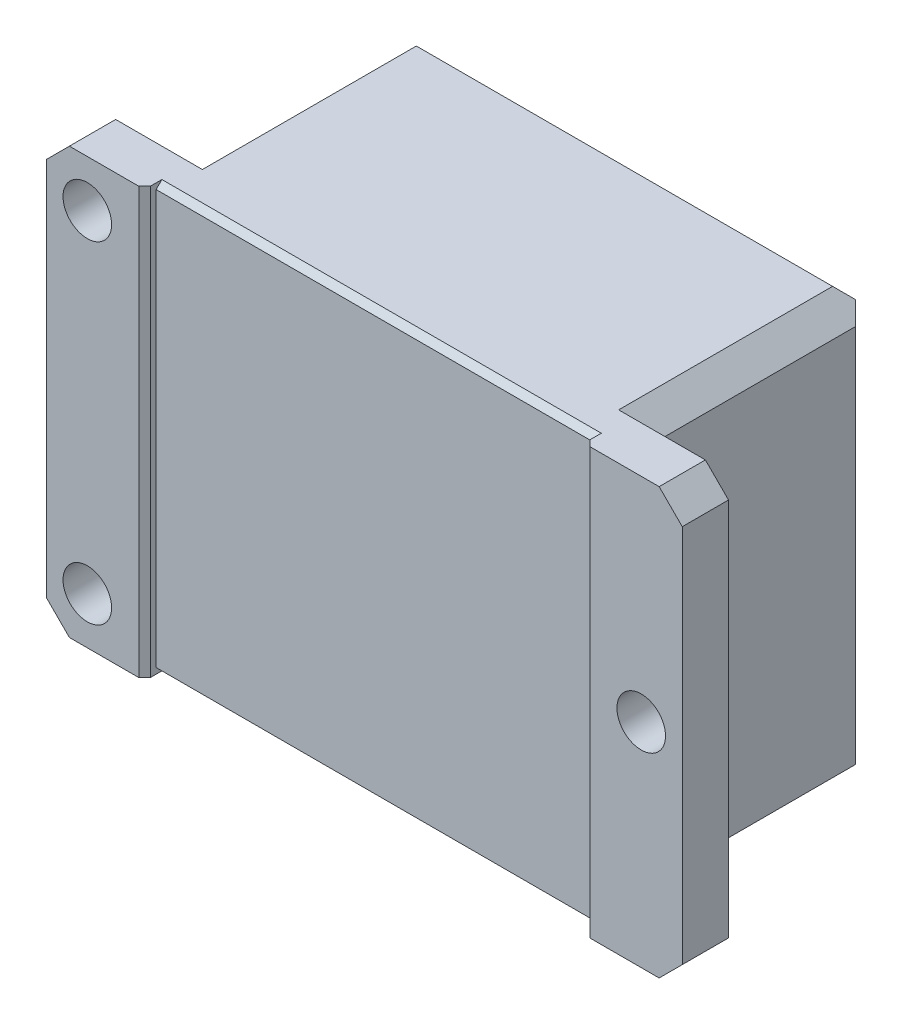
ISO-10303-21;
HEADER;
FILE_DESCRIPTION(('STEP AP214'),'2;1');
FILE_NAME('part.step','',(''),(''),'','','');
FILE_SCHEMA(('AUTOMOTIVE_DESIGN { 1 0 10303 214 1 1 1 1 }'));
ENDSEC;
DATA;
#1=APPLICATION_CONTEXT('core data for automotive mechanical design processes');
#2=APPLICATION_PROTOCOL_DEFINITION('international standard','automotive_design',2000,#1);
#3=PRODUCT_CONTEXT('',#1,'mechanical');
#4=PRODUCT('Part','Part','',(#3));
#5=PRODUCT_RELATED_PRODUCT_CATEGORY('part','',(#4));
#6=PRODUCT_DEFINITION_FORMATION('','',#4);
#7=PRODUCT_DEFINITION_CONTEXT('part definition',#1,'design');
#8=PRODUCT_DEFINITION('design','',#6,#7);
#9=PRODUCT_DEFINITION_SHAPE('','',#8);
#10=(LENGTH_UNIT() NAMED_UNIT(*) SI_UNIT(.MILLI.,.METRE.));
#11=(NAMED_UNIT(*) PLANE_ANGLE_UNIT() SI_UNIT($,.RADIAN.));
#12=(NAMED_UNIT(*) SI_UNIT($,.STERADIAN.) SOLID_ANGLE_UNIT());
#13=UNCERTAINTY_MEASURE_WITH_UNIT(LENGTH_MEASURE(1.E-05),#10,'distance_accuracy_value','');
#14=(GEOMETRIC_REPRESENTATION_CONTEXT(3) GLOBAL_UNCERTAINTY_ASSIGNED_CONTEXT((#13)) GLOBAL_UNIT_ASSIGNED_CONTEXT((#10,
#11,#12)) REPRESENTATION_CONTEXT('',''));
#15=CARTESIAN_POINT('',(0.,0.,0.));
#16=DIRECTION('',(0.,0.,1.));
#17=DIRECTION('',(1.,0.,0.));
#18=AXIS2_PLACEMENT_3D('',#15,#16,#17);
#19=CARTESIAN_POINT('',(0.,0.,24.));
#20=DIRECTION('',(-1.,0.,0.));
#21=DIRECTION('',(0.,0.,1.));
#22=AXIS2_PLACEMENT_3D('',#19,#20,#21);
#23=PLANE('',#22);
#24=DIRECTION('',(0.,-1.,0.));
#25=VECTOR('',#24,1.);
#26=CARTESIAN_POINT('',(0.,36.8,20.));
#27=LINE('',#26,#25);
#28=CARTESIAN_POINT('',(0.,34.8,20.));
#29=VERTEX_POINT('',#28);
#30=CARTESIAN_POINT('',(0.,2.00000000000001,20.));
#31=VERTEX_POINT('',#30);
#32=EDGE_CURVE('E439',#29,#31,#27,.T.);
#33=ORIENTED_EDGE('',*,*,#32,.F.);
#34=DIRECTION('',(0.,0.,1.));
#35=VECTOR('',#34,1.);
#36=CARTESIAN_POINT('',(0.,34.8,24.));
#37=LINE('',#36,#35);
#38=CARTESIAN_POINT('',(0.,34.8,24.));
#39=VERTEX_POINT('',#38);
#40=EDGE_CURVE('E392',#29,#39,#37,.T.);
#41=ORIENTED_EDGE('',*,*,#40,.T.);
#42=DIRECTION('',(0.,1.,0.));
#43=VECTOR('',#42,1.);
#44=CARTESIAN_POINT('',(0.,0.,24.));
#45=LINE('',#44,#43);
#46=CARTESIAN_POINT('',(0.,2.00000000000001,24.));
#47=VERTEX_POINT('',#46);
#48=EDGE_CURVE('E249',#47,#39,#45,.T.);
#49=ORIENTED_EDGE('',*,*,#48,.F.);
#50=DIRECTION('',(0.,0.,-1.));
#51=VECTOR('',#50,1.);
#52=CARTESIAN_POINT('',(0.,2.00000000000001,24.));
#53=LINE('',#52,#51);
#54=EDGE_CURVE('E389',#47,#31,#53,.T.);
#55=ORIENTED_EDGE('',*,*,#54,.T.);
#56=EDGE_LOOP('',(#33,#41,#49,#55));
#57=FACE_BOUND('',#56,.T.);
#58=ADVANCED_FACE('F34',(#57),#23,.F.);
#59=CARTESIAN_POINT('',(0.,0.,24.));
#60=DIRECTION('',(0.,0.,1.));
#61=DIRECTION('',(1.,0.,0.));
#62=AXIS2_PLACEMENT_3D('',#59,#60,#61);
#63=PLANE('',#62);
#64=CARTESIAN_POINT('',(-51.45,32.75,24.));
#65=DIRECTION('',(0.,0.,1.));
#66=DIRECTION('',(1.,0.,0.));
#67=AXIS2_PLACEMENT_3D('',#64,#65,#66);
#68=CIRCLE('',#67,2.1);
#69=CARTESIAN_POINT('',(-49.35,32.75,24.));
#70=VERTEX_POINT('',#69);
#71=EDGE_CURVE('E325',#70,#70,#68,.T.);
#72=ORIENTED_EDGE('',*,*,#71,.F.);
#73=EDGE_LOOP('',(#72));
#74=FACE_BOUND('',#73,.T.);
#75=CARTESIAN_POINT('',(-51.45,4.05000000000001,24.));
#76=DIRECTION('',(0.,0.,1.));
#77=DIRECTION('',(1.,0.,0.));
#78=AXIS2_PLACEMENT_3D('',#75,#76,#77);
#79=CIRCLE('',#78,2.1);
#80=CARTESIAN_POINT('',(-49.35,4.05000000000001,24.));
#81=VERTEX_POINT('',#80);
#82=EDGE_CURVE('E835',#81,#81,#79,.T.);
#83=ORIENTED_EDGE('',*,*,#82,.F.);
#84=EDGE_LOOP('',(#83));
#85=FACE_BOUND('',#84,.T.);
#86=DIRECTION('',(0.,-1.,0.));
#87=VECTOR('',#86,1.);
#88=CARTESIAN_POINT('',(-55.,0.,24.));
#89=LINE('',#88,#87);
#90=CARTESIAN_POINT('',(-55.,34.8,24.));
#91=VERTEX_POINT('',#90);
#92=CARTESIAN_POINT('',(-55.,2.00000000000001,24.));
#93=VERTEX_POINT('',#92);
#94=EDGE_CURVE('E263',#91,#93,#89,.T.);
#95=ORIENTED_EDGE('',*,*,#94,.T.);
#96=DIRECTION('',(-0.707106781186546,0.707106781186549,0.));
#97=VECTOR('',#96,1.);
#98=CARTESIAN_POINT('',(-26.5000000000001,-26.5,24.));
#99=LINE('',#98,#97);
#100=CARTESIAN_POINT('',(-53.,0.,24.));
#101=VERTEX_POINT('',#100);
#102=EDGE_CURVE('E42',#93,#101,#99,.F.);
#103=ORIENTED_EDGE('',*,*,#102,.T.);
#104=DIRECTION('',(1.,0.,0.));
#105=VECTOR('',#104,1.);
#106=CARTESIAN_POINT('',(0.,0.,24.));
#107=LINE('',#106,#105);
#108=CARTESIAN_POINT('',(-47.,0.,24.));
#109=VERTEX_POINT('',#108);
#110=EDGE_CURVE('E240',#101,#109,#107,.T.);
#111=ORIENTED_EDGE('',*,*,#110,.T.);
#112=DIRECTION('',(0.,1.,0.));
#113=VECTOR('',#112,1.);
#114=CARTESIAN_POINT('',(-47.,36.8,24.));
#115=LINE('',#114,#113);
#116=CARTESIAN_POINT('',(-47.,36.8,24.));
#117=VERTEX_POINT('',#116);
#118=EDGE_CURVE('E277',#109,#117,#115,.T.);
#119=ORIENTED_EDGE('',*,*,#118,.T.);
#120=DIRECTION('',(-1.,0.,0.));
#121=VECTOR('',#120,1.);
#122=CARTESIAN_POINT('',(0.,36.8,24.));
#123=LINE('',#122,#121);
#124=CARTESIAN_POINT('',(-53.,36.8,24.));
#125=VERTEX_POINT('',#124);
#126=EDGE_CURVE('E260',#117,#125,#123,.T.);
#127=ORIENTED_EDGE('',*,*,#126,.T.);
#128=DIRECTION('',(0.707106781186549,0.707106781186546,0.));
#129=VECTOR('',#128,1.);
#130=CARTESIAN_POINT('',(-44.8999999999999,44.9,24.));
#131=LINE('',#130,#129);
#132=EDGE_CURVE('E56',#125,#91,#131,.F.);
#133=ORIENTED_EDGE('',*,*,#132,.T.);
#134=EDGE_LOOP('',(#95,#103,#111,#119,#127,#133));
#135=FACE_BOUND('',#134,.T.);
#136=ADVANCED_FACE('F413',(#74,#85,#135),#63,.T.);
#137=CARTESIAN_POINT('',(0.,36.8,24.));
#138=DIRECTION('',(0.,-1.,0.));
#139=DIRECTION('',(0.,0.,-1.));
#140=AXIS2_PLACEMENT_3D('',#137,#138,#139);
#141=PLANE('',#140);
#142=CARTESIAN_POINT('',(-2.00000000000001,36.8,24.));
#143=VERTEX_POINT('',#142);
#144=CARTESIAN_POINT('',(-7.99999999999998,36.8,24.));
#145=VERTEX_POINT('',#144);
#146=EDGE_CURVE('E261',#143,#145,#123,.T.);
#147=ORIENTED_EDGE('',*,*,#146,.F.);
#148=DIRECTION('',(0.,0.,-1.));
#149=VECTOR('',#148,1.);
#150=CARTESIAN_POINT('',(-2.00000000000001,36.8,24.));
#151=LINE('',#150,#149);
#152=CARTESIAN_POINT('',(-2.00000000000001,36.8,20.));
#153=VERTEX_POINT('',#152);
#154=EDGE_CURVE('E382',#143,#153,#151,.T.);
#155=ORIENTED_EDGE('',*,*,#154,.T.);
#156=DIRECTION('',(1.,0.,0.));
#157=VECTOR('',#156,1.);
#158=CARTESIAN_POINT('',(0.,36.8,20.));
#159=LINE('',#158,#157);
#160=CARTESIAN_POINT('',(-9.50000000000001,36.8,20.));
#161=VERTEX_POINT('',#160);
#162=EDGE_CURVE('E433',#161,#153,#159,.T.);
#163=ORIENTED_EDGE('',*,*,#162,.F.);
#164=DIRECTION('',(0.,0.,-1.));
#165=VECTOR('',#164,1.);
#166=CARTESIAN_POINT('',(-9.50000000000001,36.8,24.));
#167=LINE('',#166,#165);
#168=CARTESIAN_POINT('',(-9.50000000000001,36.8,1.5));
#169=VERTEX_POINT('',#168);
#170=EDGE_CURVE('E355',#161,#169,#167,.T.);
#171=ORIENTED_EDGE('',*,*,#170,.T.);
#172=DIRECTION('',(-1.,0.,0.));
#173=VECTOR('',#172,1.);
#174=CARTESIAN_POINT('',(0.,36.8,1.5));
#175=LINE('',#174,#173);
#176=CARTESIAN_POINT('',(-45.5,36.8,1.5));
#177=VERTEX_POINT('',#176);
#178=EDGE_CURVE('E311',#169,#177,#175,.T.);
#179=ORIENTED_EDGE('',*,*,#178,.T.);
#180=DIRECTION('',(0.,0.,1.));
#181=VECTOR('',#180,1.);
#182=CARTESIAN_POINT('',(-45.5,36.8,24.));
#183=LINE('',#182,#181);
#184=CARTESIAN_POINT('',(-45.5,36.8,20.));
#185=VERTEX_POINT('',#184);
#186=EDGE_CURVE('E358',#177,#185,#183,.T.);
#187=ORIENTED_EDGE('',*,*,#186,.T.);
#188=DIRECTION('',(1.,0.,0.));
#189=VECTOR('',#188,1.);
#190=CARTESIAN_POINT('',(-55.,36.8,20.));
#191=LINE('',#190,#189);
#192=CARTESIAN_POINT('',(-53.,36.8,20.));
#193=VERTEX_POINT('',#192);
#194=EDGE_CURVE('E428',#193,#185,#191,.T.);
#195=ORIENTED_EDGE('',*,*,#194,.F.);
#196=DIRECTION('',(0.,0.,1.));
#197=VECTOR('',#196,1.);
#198=CARTESIAN_POINT('',(-53.,36.8,24.));
#199=LINE('',#198,#197);
#200=EDGE_CURVE('E380',#193,#125,#199,.T.);
#201=ORIENTED_EDGE('',*,*,#200,.T.);
#202=ORIENTED_EDGE('',*,*,#126,.F.);
#203=DIRECTION('',(0.707106781186552,0.,-0.707106781186543));
#204=VECTOR('',#203,1.);
#205=CARTESIAN_POINT('',(-46.5,36.8,23.5));
#206=LINE('',#205,#204);
#207=CARTESIAN_POINT('',(-46.5,36.8,23.5));
#208=VERTEX_POINT('',#207);
#209=EDGE_CURVE('E231',#117,#208,#206,.T.);
#210=ORIENTED_EDGE('',*,*,#209,.T.);
#211=DIRECTION('',(0.,0.,1.));
#212=VECTOR('',#211,1.);
#213=CARTESIAN_POINT('',(-46.5,36.8,23.));
#214=LINE('',#213,#212);
#215=CARTESIAN_POINT('',(-46.5,36.8,22.5));
#216=VERTEX_POINT('',#215);
#217=EDGE_CURVE('E246',#216,#208,#214,.T.);
#218=ORIENTED_EDGE('',*,*,#217,.F.);
#219=DIRECTION('',(1.,0.,0.));
#220=VECTOR('',#219,1.);
#221=CARTESIAN_POINT('',(-8.49999999999999,36.8,22.5));
#222=LINE('',#221,#220);
#223=CARTESIAN_POINT('',(-8.49999999999999,36.8,22.5));
#224=VERTEX_POINT('',#223);
#225=EDGE_CURVE('E244',#216,#224,#222,.T.);
#226=ORIENTED_EDGE('',*,*,#225,.T.);
#227=DIRECTION('',(0.,0.,1.));
#228=VECTOR('',#227,1.);
#229=CARTESIAN_POINT('',(-8.49999999999999,36.8,23.));
#230=LINE('',#229,#228);
#231=CARTESIAN_POINT('',(-8.49999999999999,36.8,23.5));
#232=VERTEX_POINT('',#231);
#233=EDGE_CURVE('E236',#224,#232,#230,.T.);
#234=ORIENTED_EDGE('',*,*,#233,.T.);
#235=DIRECTION('',(0.707106781186552,0.,0.707106781186543));
#236=VECTOR('',#235,1.);
#237=CARTESIAN_POINT('',(-8.49999999999999,36.8,23.5));
#238=LINE('',#237,#236);
#239=EDGE_CURVE('E222',#232,#145,#238,.T.);
#240=ORIENTED_EDGE('',*,*,#239,.T.);
#241=EDGE_LOOP('',(#147,#155,#163,#171,#179,#187,#195,#201,#202,#210,#218,#226,#234,#240));
#242=FACE_BOUND('',#241,.T.);
#243=ADVANCED_FACE('F242',(#242),#141,.F.);
#244=CARTESIAN_POINT('',(-55.,0.,24.));
#245=DIRECTION('',(1.,0.,0.));
#246=DIRECTION('',(0.,0.,-1.));
#247=AXIS2_PLACEMENT_3D('',#244,#245,#246);
#248=PLANE('',#247);
#249=DIRECTION('',(0.,1.,0.));
#250=VECTOR('',#249,1.);
#251=CARTESIAN_POINT('',(-55.,36.8,20.));
#252=LINE('',#251,#250);
#253=CARTESIAN_POINT('',(-55.,2.00000000000002,20.));
#254=VERTEX_POINT('',#253);
#255=CARTESIAN_POINT('',(-55.,34.8,20.));
#256=VERTEX_POINT('',#255);
#257=EDGE_CURVE('E332',#254,#256,#252,.T.);
#258=ORIENTED_EDGE('',*,*,#257,.F.);
#259=DIRECTION('',(0.,0.,1.));
#260=VECTOR('',#259,1.);
#261=CARTESIAN_POINT('',(-55.,2.00000000000001,24.));
#262=LINE('',#261,#260);
#263=EDGE_CURVE('E49',#254,#93,#262,.T.);
#264=ORIENTED_EDGE('',*,*,#263,.T.);
#265=ORIENTED_EDGE('',*,*,#94,.F.);
#266=DIRECTION('',(0.,0.,-1.));
#267=VECTOR('',#266,1.);
#268=CARTESIAN_POINT('',(-55.,34.8,24.));
#269=LINE('',#268,#267);
#270=EDGE_CURVE('E407',#91,#256,#269,.T.);
#271=ORIENTED_EDGE('',*,*,#270,.T.);
#272=EDGE_LOOP('',(#258,#264,#265,#271));
#273=FACE_BOUND('',#272,.T.);
#274=ADVANCED_FACE('F426',(#273),#248,.F.);
#275=CARTESIAN_POINT('',(0.,0.,24.));
#276=DIRECTION('',(0.,1.,0.));
#277=DIRECTION('',(-1.,0.,0.));
#278=AXIS2_PLACEMENT_3D('',#275,#276,#277);
#279=PLANE('',#278);
#280=DIRECTION('',(-1.,0.,0.));
#281=VECTOR('',#280,1.);
#282=CARTESIAN_POINT('',(0.,0.,20.));
#283=LINE('',#282,#281);
#284=CARTESIAN_POINT('',(-2.00000000000002,0.,20.));
#285=VERTEX_POINT('',#284);
#286=CARTESIAN_POINT('',(-9.50000000000002,0.,20.));
#287=VERTEX_POINT('',#286);
#288=EDGE_CURVE('E475',#285,#287,#283,.T.);
#289=ORIENTED_EDGE('',*,*,#288,.F.);
#290=DIRECTION('',(0.,0.,1.));
#291=VECTOR('',#290,1.);
#292=CARTESIAN_POINT('',(-2.00000000000002,0.,24.));
#293=LINE('',#292,#291);
#294=CARTESIAN_POINT('',(-2.00000000000002,0.,24.));
#295=VERTEX_POINT('',#294);
#296=EDGE_CURVE('E401',#285,#295,#293,.T.);
#297=ORIENTED_EDGE('',*,*,#296,.T.);
#298=CARTESIAN_POINT('',(-7.99999999999998,0.,24.));
#299=VERTEX_POINT('',#298);
#300=EDGE_CURVE('E265',#299,#295,#107,.T.);
#301=ORIENTED_EDGE('',*,*,#300,.F.);
#302=DIRECTION('',(-0.707106781186552,0.,-0.707106781186543));
#303=VECTOR('',#302,1.);
#304=CARTESIAN_POINT('',(-8.49999999999999,0.,23.5));
#305=LINE('',#304,#303);
#306=CARTESIAN_POINT('',(-8.49999999999999,0.,23.5));
#307=VERTEX_POINT('',#306);
#308=EDGE_CURVE('E272',#299,#307,#305,.T.);
#309=ORIENTED_EDGE('',*,*,#308,.T.);
#310=DIRECTION('',(0.,0.,1.));
#311=VECTOR('',#310,1.);
#312=CARTESIAN_POINT('',(-8.49999999999999,0.,23.));
#313=LINE('',#312,#311);
#314=CARTESIAN_POINT('',(-8.49999999999999,0.,22.5));
#315=VERTEX_POINT('',#314);
#316=EDGE_CURVE('E239',#315,#307,#313,.T.);
#317=ORIENTED_EDGE('',*,*,#316,.F.);
#318=DIRECTION('',(-1.,0.,0.));
#319=VECTOR('',#318,1.);
#320=CARTESIAN_POINT('',(-46.5,0.,22.5));
#321=LINE('',#320,#319);
#322=CARTESIAN_POINT('',(-46.5,0.,22.5));
#323=VERTEX_POINT('',#322);
#324=EDGE_CURVE('E285',#315,#323,#321,.T.);
#325=ORIENTED_EDGE('',*,*,#324,.T.);
#326=DIRECTION('',(0.,0.,1.));
#327=VECTOR('',#326,1.);
#328=CARTESIAN_POINT('',(-46.5,0.,23.));
#329=LINE('',#328,#327);
#330=CARTESIAN_POINT('',(-46.5,0.,23.5));
#331=VERTEX_POINT('',#330);
#332=EDGE_CURVE('E251',#323,#331,#329,.T.);
#333=ORIENTED_EDGE('',*,*,#332,.T.);
#334=DIRECTION('',(-0.707106781186552,0.,0.707106781186543));
#335=VECTOR('',#334,1.);
#336=CARTESIAN_POINT('',(-46.5,0.,23.5));
#337=LINE('',#336,#335);
#338=EDGE_CURVE('E269',#331,#109,#337,.T.);
#339=ORIENTED_EDGE('',*,*,#338,.T.);
#340=ORIENTED_EDGE('',*,*,#110,.F.);
#341=DIRECTION('',(0.,0.,-1.));
#342=VECTOR('',#341,1.);
#343=CARTESIAN_POINT('',(-53.,0.,24.));
#344=LINE('',#343,#342);
#345=CARTESIAN_POINT('',(-53.,0.,20.));
#346=VERTEX_POINT('',#345);
#347=EDGE_CURVE('E398',#101,#346,#344,.T.);
#348=ORIENTED_EDGE('',*,*,#347,.T.);
#349=DIRECTION('',(-1.,0.,0.));
#350=VECTOR('',#349,1.);
#351=CARTESIAN_POINT('',(-55.,0.,20.));
#352=LINE('',#351,#350);
#353=CARTESIAN_POINT('',(-45.5,0.,20.));
#354=VERTEX_POINT('',#353);
#355=EDGE_CURVE('E425',#354,#346,#352,.T.);
#356=ORIENTED_EDGE('',*,*,#355,.F.);
#357=DIRECTION('',(0.,0.,-1.));
#358=VECTOR('',#357,1.);
#359=CARTESIAN_POINT('',(-45.5,0.,24.));
#360=LINE('',#359,#358);
#361=CARTESIAN_POINT('',(-45.5,0.,1.5));
#362=VERTEX_POINT('',#361);
#363=EDGE_CURVE('E335',#354,#362,#360,.T.);
#364=ORIENTED_EDGE('',*,*,#363,.T.);
#365=DIRECTION('',(1.,0.,0.));
#366=VECTOR('',#365,1.);
#367=CARTESIAN_POINT('',(0.,0.,1.5));
#368=LINE('',#367,#366);
#369=CARTESIAN_POINT('',(-9.50000000000002,0.,1.5));
#370=VERTEX_POINT('',#369);
#371=EDGE_CURVE('E317',#362,#370,#368,.T.);
#372=ORIENTED_EDGE('',*,*,#371,.T.);
#373=DIRECTION('',(0.,0.,1.));
#374=VECTOR('',#373,1.);
#375=CARTESIAN_POINT('',(-9.50000000000002,0.,24.));
#376=LINE('',#375,#374);
#377=EDGE_CURVE('E320',#370,#287,#376,.T.);
#378=ORIENTED_EDGE('',*,*,#377,.T.);
#379=EDGE_LOOP('',(#289,#297,#301,#309,#317,#325,#333,#339,#340,#348,#356,#364,#372,#378));
#380=FACE_BOUND('',#379,.T.);
#381=ADVANCED_FACE('F418',(#380),#279,.F.);
#382=CARTESIAN_POINT('',(-3.55,18.4,24.));
#383=DIRECTION('',(0.,0.,1.));
#384=DIRECTION('',(1.,0.,0.));
#385=AXIS2_PLACEMENT_3D('',#382,#383,#384);
#386=CIRCLE('',#385,2.1);
#387=CARTESIAN_POINT('',(-1.45,18.4,24.));
#388=VERTEX_POINT('',#387);
#389=EDGE_CURVE('E831',#388,#388,#386,.T.);
#390=ORIENTED_EDGE('',*,*,#389,.F.);
#391=EDGE_LOOP('',(#390));
#392=FACE_BOUND('',#391,.T.);
#393=ORIENTED_EDGE('',*,*,#48,.T.);
#394=DIRECTION('',(0.707106781186546,-0.707106781186549,0.));
#395=VECTOR('',#394,1.);
#396=CARTESIAN_POINT('',(17.4,17.3999999999999,24.));
#397=LINE('',#396,#395);
#398=EDGE_CURVE('E396',#39,#143,#397,.F.);
#399=ORIENTED_EDGE('',*,*,#398,.T.);
#400=ORIENTED_EDGE('',*,*,#146,.T.);
#401=DIRECTION('',(0.,-1.,0.));
#402=VECTOR('',#401,1.);
#403=CARTESIAN_POINT('',(-7.99999999999998,0.,24.));
#404=LINE('',#403,#402);
#405=EDGE_CURVE('E227',#145,#299,#404,.T.);
#406=ORIENTED_EDGE('',*,*,#405,.T.);
#407=ORIENTED_EDGE('',*,*,#300,.T.);
#408=DIRECTION('',(-0.707106781186549,-0.707106781186546,0.));
#409=VECTOR('',#408,1.);
#410=CARTESIAN_POINT('',(-1.,1.00000000000001,24.));
#411=LINE('',#410,#409);
#412=EDGE_CURVE('E394',#295,#47,#411,.F.);
#413=ORIENTED_EDGE('',*,*,#412,.T.);
#414=EDGE_LOOP('',(#393,#399,#400,#406,#407,#413));
#415=FACE_BOUND('',#414,.T.);
#416=ADVANCED_FACE('F463',(#392,#415),#63,.T.);
#417=CARTESIAN_POINT('',(0.,0.,0.));
#418=DIRECTION('',(0.,0.,1.));
#419=DIRECTION('',(1.,0.,0.));
#420=AXIS2_PLACEMENT_3D('',#417,#418,#419);
#421=PLANE('',#420);
#422=DIRECTION('',(1.,0.,0.));
#423=VECTOR('',#422,1.);
#424=CARTESIAN_POINT('',(0.,35.3,0.));
#425=LINE('',#424,#423);
#426=CARTESIAN_POINT('',(-46.,35.3,0.));
#427=VERTEX_POINT('',#426);
#428=CARTESIAN_POINT('',(-9.,35.3,0.));
#429=VERTEX_POINT('',#428);
#430=EDGE_CURVE('E306',#427,#429,#425,.T.);
#431=ORIENTED_EDGE('',*,*,#430,.T.);
#432=DIRECTION('',(0.,-1.,0.));
#433=VECTOR('',#432,1.);
#434=CARTESIAN_POINT('',(-9.00000000000001,0.,0.));
#435=LINE('',#434,#433);
#436=CARTESIAN_POINT('',(-9.00000000000001,1.5,0.));
#437=VERTEX_POINT('',#436);
#438=EDGE_CURVE('E308',#429,#437,#435,.T.);
#439=ORIENTED_EDGE('',*,*,#438,.T.);
#440=DIRECTION('',(-1.,0.,0.));
#441=VECTOR('',#440,1.);
#442=CARTESIAN_POINT('',(0.,1.5,0.));
#443=LINE('',#442,#441);
#444=CARTESIAN_POINT('',(-46.,1.5,0.));
#445=VERTEX_POINT('',#444);
#446=EDGE_CURVE('E301',#437,#445,#443,.T.);
#447=ORIENTED_EDGE('',*,*,#446,.T.);
#448=DIRECTION('',(0.,1.,0.));
#449=VECTOR('',#448,1.);
#450=CARTESIAN_POINT('',(-46.,0.,0.));
#451=LINE('',#450,#449);
#452=EDGE_CURVE('E304',#445,#427,#451,.T.);
#453=ORIENTED_EDGE('',*,*,#452,.T.);
#454=EDGE_LOOP('',(#431,#439,#447,#453));
#455=FACE_BOUND('',#454,.T.);
#456=ADVANCED_FACE('F559',(#455),#421,.F.);
#457=CARTESIAN_POINT('',(-46.5,0.,23.));
#458=DIRECTION('',(-1.,0.,0.));
#459=DIRECTION('',(0.,0.,1.));
#460=AXIS2_PLACEMENT_3D('',#457,#458,#459);
#461=PLANE('',#460);
#462=ORIENTED_EDGE('',*,*,#217,.T.);
#463=DIRECTION('',(0.,-1.,0.));
#464=VECTOR('',#463,1.);
#465=CARTESIAN_POINT('',(-46.5,0.,23.5));
#466=LINE('',#465,#464);
#467=EDGE_CURVE('E274',#208,#331,#466,.T.);
#468=ORIENTED_EDGE('',*,*,#467,.T.);
#469=ORIENTED_EDGE('',*,*,#332,.F.);
#470=DIRECTION('',(0.,0.707106781186543,0.707106781186552));
#471=VECTOR('',#470,1.);
#472=CARTESIAN_POINT('',(-46.5,0.249999999999989,22.75));
#473=LINE('',#472,#471);
#474=CARTESIAN_POINT('',(-46.5,0.499999999999981,23.));
#475=VERTEX_POINT('',#474);
#476=EDGE_CURVE('E291',#323,#475,#473,.T.);
#477=ORIENTED_EDGE('',*,*,#476,.T.);
#478=DIRECTION('',(0.,-1.,0.));
#479=VECTOR('',#478,1.);
#480=CARTESIAN_POINT('',(-46.5,0.,23.));
#481=LINE('',#480,#479);
#482=CARTESIAN_POINT('',(-46.5,36.3,23.));
#483=VERTEX_POINT('',#482);
#484=EDGE_CURVE('E440',#483,#475,#481,.T.);
#485=ORIENTED_EDGE('',*,*,#484,.F.);
#486=DIRECTION('',(0.,0.707106781186552,-0.707106781186543));
#487=VECTOR('',#486,1.);
#488=CARTESIAN_POINT('',(-46.5,18.1499999999997,41.15));
#489=LINE('',#488,#487);
#490=EDGE_CURVE('E293',#483,#216,#489,.T.);
#491=ORIENTED_EDGE('',*,*,#490,.T.);
#492=EDGE_LOOP('',(#462,#468,#469,#477,#485,#491));
#493=FACE_BOUND('',#492,.T.);
#494=ADVANCED_FACE('F452',(#493),#461,.F.);
#495=CARTESIAN_POINT('',(-8.49999999999999,0.,23.));
#496=DIRECTION('',(1.,0.,0.));
#497=DIRECTION('',(0.,0.,-1.));
#498=AXIS2_PLACEMENT_3D('',#495,#496,#497);
#499=PLANE('',#498);
#500=ORIENTED_EDGE('',*,*,#316,.T.);
#501=DIRECTION('',(0.,1.,0.));
#502=VECTOR('',#501,1.);
#503=CARTESIAN_POINT('',(-8.49999999999999,36.8,23.5));
#504=LINE('',#503,#502);
#505=EDGE_CURVE('E226',#307,#232,#504,.T.);
#506=ORIENTED_EDGE('',*,*,#505,.T.);
#507=ORIENTED_EDGE('',*,*,#233,.F.);
#508=DIRECTION('',(0.,-0.707106781186552,0.707106781186543));
#509=VECTOR('',#508,1.);
#510=CARTESIAN_POINT('',(-8.49999999999999,18.1499999999997,41.15));
#511=LINE('',#510,#509);
#512=CARTESIAN_POINT('',(-8.49999999999999,36.3,23.));
#513=VERTEX_POINT('',#512);
#514=EDGE_CURVE('E296',#224,#513,#511,.T.);
#515=ORIENTED_EDGE('',*,*,#514,.T.);
#516=DIRECTION('',(0.,1.,0.));
#517=VECTOR('',#516,1.);
#518=CARTESIAN_POINT('',(-8.49999999999999,0.,23.));
#519=LINE('',#518,#517);
#520=CARTESIAN_POINT('',(-8.49999999999999,0.499999999999986,23.));
#521=VERTEX_POINT('',#520);
#522=EDGE_CURVE('E257',#521,#513,#519,.T.);
#523=ORIENTED_EDGE('',*,*,#522,.F.);
#524=DIRECTION('',(0.,-0.707106781186543,-0.707106781186552));
#525=VECTOR('',#524,1.);
#526=CARTESIAN_POINT('',(-8.49999999999999,0.249999999999993,22.75));
#527=LINE('',#526,#525);
#528=EDGE_CURVE('E289',#521,#315,#527,.T.);
#529=ORIENTED_EDGE('',*,*,#528,.T.);
#530=EDGE_LOOP('',(#500,#506,#507,#515,#523,#529));
#531=FACE_BOUND('',#530,.T.);
#532=ADVANCED_FACE('F235',(#531),#499,.F.);
#533=CARTESIAN_POINT('',(0.,0.,23.));
#534=DIRECTION('',(0.,0.,1.));
#535=DIRECTION('',(1.,0.,0.));
#536=AXIS2_PLACEMENT_3D('',#533,#534,#535);
#537=PLANE('',#536);
#538=ORIENTED_EDGE('',*,*,#484,.T.);
#539=DIRECTION('',(1.,0.,0.));
#540=VECTOR('',#539,1.);
#541=CARTESIAN_POINT('',(-8.49999999999999,0.499999999999986,23.));
#542=LINE('',#541,#540);
#543=EDGE_CURVE('E282',#475,#521,#542,.T.);
#544=ORIENTED_EDGE('',*,*,#543,.T.);
#545=ORIENTED_EDGE('',*,*,#522,.T.);
#546=DIRECTION('',(-1.,0.,0.));
#547=VECTOR('',#546,1.);
#548=CARTESIAN_POINT('',(-46.5,36.3,23.));
#549=LINE('',#548,#547);
#550=EDGE_CURVE('E279',#513,#483,#549,.T.);
#551=ORIENTED_EDGE('',*,*,#550,.T.);
#552=EDGE_LOOP('',(#538,#544,#545,#551));
#553=FACE_BOUND('',#552,.T.);
#554=ADVANCED_FACE('F446',(#553),#537,.T.);
#555=CARTESIAN_POINT('',(-8.49999999999999,0.,23.5));
#556=DIRECTION('',(-0.707106781186543,0.,0.707106781186552));
#557=DIRECTION('',(0.,-1.,0.));
#558=AXIS2_PLACEMENT_3D('',#555,#556,#557);
#559=PLANE('',#558);
#560=ORIENTED_EDGE('',*,*,#308,.F.);
#561=ORIENTED_EDGE('',*,*,#405,.F.);
#562=ORIENTED_EDGE('',*,*,#239,.F.);
#563=ORIENTED_EDGE('',*,*,#505,.F.);
#564=EDGE_LOOP('',(#560,#561,#562,#563));
#565=FACE_BOUND('',#564,.T.);
#566=ADVANCED_FACE('F225',(#565),#559,.T.);
#567=CARTESIAN_POINT('',(-46.5,0.,23.5));
#568=DIRECTION('',(0.707106781186543,0.,0.707106781186552));
#569=DIRECTION('',(0.,1.,0.));
#570=AXIS2_PLACEMENT_3D('',#567,#568,#569);
#571=PLANE('',#570);
#572=ORIENTED_EDGE('',*,*,#209,.F.);
#573=ORIENTED_EDGE('',*,*,#118,.F.);
#574=ORIENTED_EDGE('',*,*,#338,.F.);
#575=ORIENTED_EDGE('',*,*,#467,.F.);
#576=EDGE_LOOP('',(#572,#573,#574,#575));
#577=FACE_BOUND('',#576,.T.);
#578=ADVANCED_FACE('F513',(#577),#571,.T.);
#579=CARTESIAN_POINT('',(0.,0.499999999999987,23.));
#580=DIRECTION('',(0.,-0.707106781186552,0.707106781186543));
#581=DIRECTION('',(-1.,0.,0.));
#582=AXIS2_PLACEMENT_3D('',#579,#580,#581);
#583=PLANE('',#582);
#584=ORIENTED_EDGE('',*,*,#476,.F.);
#585=ORIENTED_EDGE('',*,*,#324,.F.);
#586=ORIENTED_EDGE('',*,*,#528,.F.);
#587=ORIENTED_EDGE('',*,*,#543,.F.);
#588=EDGE_LOOP('',(#584,#585,#586,#587));
#589=FACE_BOUND('',#588,.T.);
#590=ADVANCED_FACE('F456',(#589),#583,.T.);
#591=CARTESIAN_POINT('',(0.,36.3,23.));
#592=DIRECTION('',(0.,0.707106781186543,0.707106781186552));
#593=DIRECTION('',(1.,0.,0.));
#594=AXIS2_PLACEMENT_3D('',#591,#592,#593);
#595=PLANE('',#594);
#596=ORIENTED_EDGE('',*,*,#514,.F.);
#597=ORIENTED_EDGE('',*,*,#225,.F.);
#598=ORIENTED_EDGE('',*,*,#490,.F.);
#599=ORIENTED_EDGE('',*,*,#550,.F.);
#600=EDGE_LOOP('',(#596,#597,#598,#599));
#601=FACE_BOUND('',#600,.T.);
#602=ADVANCED_FACE('F450',(#601),#595,.T.);
#603=CARTESIAN_POINT('',(-47.5,36.8,20.));
#604=DIRECTION('',(1.,0.,0.));
#605=DIRECTION('',(0.,1.,0.));
#606=AXIS2_PLACEMENT_3D('',#603,#604,#605);
#607=PLANE('',#606);
#608=CARTESIAN_POINT('',(-47.5,18.4,10.));
#609=DIRECTION('',(1.,0.,0.));
#610=DIRECTION('',(0.,1.,0.));
#611=AXIS2_PLACEMENT_3D('',#608,#609,#610);
#612=CIRCLE('',#611,5.);
#613=CARTESIAN_POINT('',(-47.5,23.4,10.));
#614=VERTEX_POINT('',#613);
#615=EDGE_CURVE('E11',#614,#614,#612,.F.);
#616=ORIENTED_EDGE('',*,*,#615,.F.);
#617=EDGE_LOOP('',(#616));
#618=FACE_BOUND('',#617,.T.);
#619=DIRECTION('',(0.,-1.,0.));
#620=VECTOR('',#619,1.);
#621=CARTESIAN_POINT('',(-47.5,36.8,1.5));
#622=LINE('',#621,#620);
#623=CARTESIAN_POINT('',(-47.5,34.8,1.5));
#624=VERTEX_POINT('',#623);
#625=CARTESIAN_POINT('',(-47.5,1.99999999999999,1.5));
#626=VERTEX_POINT('',#625);
#627=EDGE_CURVE('E314',#624,#626,#622,.T.);
#628=ORIENTED_EDGE('',*,*,#627,.T.);
#629=DIRECTION('',(0.,0.,1.));
#630=VECTOR('',#629,1.);
#631=CARTESIAN_POINT('',(-47.5,1.99999999999999,20.));
#632=LINE('',#631,#630);
#633=CARTESIAN_POINT('',(-47.5,2.,20.));
#634=VERTEX_POINT('',#633);
#635=EDGE_CURVE('E349',#626,#634,#632,.T.);
#636=ORIENTED_EDGE('',*,*,#635,.T.);
#637=DIRECTION('',(0.,-1.,0.));
#638=VECTOR('',#637,1.);
#639=CARTESIAN_POINT('',(-47.5,36.8,20.));
#640=LINE('',#639,#638);
#641=CARTESIAN_POINT('',(-47.5,34.8,20.));
#642=VERTEX_POINT('',#641);
#643=EDGE_CURVE('E430',#642,#634,#640,.T.);
#644=ORIENTED_EDGE('',*,*,#643,.F.);
#645=DIRECTION('',(0.,0.,-1.));
#646=VECTOR('',#645,1.);
#647=CARTESIAN_POINT('',(-47.5,34.8,20.));
#648=LINE('',#647,#646);
#649=EDGE_CURVE('E346',#642,#624,#648,.T.);
#650=ORIENTED_EDGE('',*,*,#649,.T.);
#651=EDGE_LOOP('',(#628,#636,#644,#650));
#652=FACE_BOUND('',#651,.T.);
#653=ADVANCED_FACE('F521',(#618,#652),#607,.F.);
#654=CARTESIAN_POINT('',(0.,0.,20.));
#655=DIRECTION('',(0.,0.,1.));
#656=DIRECTION('',(1.,0.,0.));
#657=AXIS2_PLACEMENT_3D('',#654,#655,#656);
#658=PLANE('',#657);
#659=CARTESIAN_POINT('',(-51.45,32.75,20.));
#660=DIRECTION('',(0.,0.,-1.));
#661=DIRECTION('',(-1.,0.,0.));
#662=AXIS2_PLACEMENT_3D('',#659,#660,#661);
#663=CIRCLE('',#662,2.1);
#664=CARTESIAN_POINT('',(-53.55,32.75,20.));
#665=VERTEX_POINT('',#664);
#666=EDGE_CURVE('E825',#665,#665,#663,.T.);
#667=ORIENTED_EDGE('',*,*,#666,.F.);
#668=EDGE_LOOP('',(#667));
#669=FACE_BOUND('',#668,.T.);
#670=CARTESIAN_POINT('',(-51.45,4.05000000000001,20.));
#671=DIRECTION('',(0.,0.,-1.));
#672=DIRECTION('',(-1.,0.,0.));
#673=AXIS2_PLACEMENT_3D('',#670,#671,#672);
#674=CIRCLE('',#673,2.1);
#675=CARTESIAN_POINT('',(-53.55,4.05000000000001,20.));
#676=VERTEX_POINT('',#675);
#677=EDGE_CURVE('E822',#676,#676,#674,.T.);
#678=ORIENTED_EDGE('',*,*,#677,.F.);
#679=EDGE_LOOP('',(#678));
#680=FACE_BOUND('',#679,.T.);
#681=ORIENTED_EDGE('',*,*,#355,.T.);
#682=DIRECTION('',(0.707106781186546,-0.707106781186549,0.));
#683=VECTOR('',#682,1.);
#684=CARTESIAN_POINT('',(-53.,0.,20.));
#685=LINE('',#684,#683);
#686=EDGE_CURVE('E405',#346,#254,#685,.F.);
#687=ORIENTED_EDGE('',*,*,#686,.T.);
#688=ORIENTED_EDGE('',*,*,#257,.T.);
#689=DIRECTION('',(-0.707106781186549,-0.707106781186546,0.));
#690=VECTOR('',#689,1.);
#691=CARTESIAN_POINT('',(-55.,34.8,20.));
#692=LINE('',#691,#690);
#693=EDGE_CURVE('E403',#256,#193,#692,.F.);
#694=ORIENTED_EDGE('',*,*,#693,.T.);
#695=ORIENTED_EDGE('',*,*,#194,.T.);
#696=DIRECTION('',(0.707106781186549,0.707106781186546,0.));
#697=VECTOR('',#696,1.);
#698=CARTESIAN_POINT('',(-41.1499999999999,41.15,20.));
#699=LINE('',#698,#697);
#700=EDGE_CURVE('E373',#185,#642,#699,.F.);
#701=ORIENTED_EDGE('',*,*,#700,.T.);
#702=ORIENTED_EDGE('',*,*,#643,.T.);
#703=DIRECTION('',(-0.707106781186547,0.707106781186548,0.));
#704=VECTOR('',#703,1.);
#705=CARTESIAN_POINT('',(-22.7500000000001,-22.75,20.));
#706=LINE('',#705,#704);
#707=EDGE_CURVE('E370',#634,#354,#706,.F.);
#708=ORIENTED_EDGE('',*,*,#707,.T.);
#709=EDGE_LOOP('',(#681,#687,#688,#694,#695,#701,#702,#708));
#710=FACE_BOUND('',#709,.T.);
#711=ADVANCED_FACE('F424',(#669,#680,#710),#658,.F.);
#712=CARTESIAN_POINT('',(-7.5,36.8,20.));
#713=DIRECTION('',(-1.,0.,0.));
#714=DIRECTION('',(0.,-1.,0.));
#715=AXIS2_PLACEMENT_3D('',#712,#713,#714);
#716=PLANE('',#715);
#717=DIRECTION('',(0.,1.,0.));
#718=VECTOR('',#717,1.);
#719=CARTESIAN_POINT('',(-7.5,36.8,1.5));
#720=LINE('',#719,#718);
#721=CARTESIAN_POINT('',(-7.50000000000001,2.,1.5));
#722=VERTEX_POINT('',#721);
#723=CARTESIAN_POINT('',(-7.5,34.8,1.5));
#724=VERTEX_POINT('',#723);
#725=EDGE_CURVE('E298',#722,#724,#720,.T.);
#726=ORIENTED_EDGE('',*,*,#725,.T.);
#727=DIRECTION('',(0.,0.,1.));
#728=VECTOR('',#727,1.);
#729=CARTESIAN_POINT('',(-7.5,34.8,20.));
#730=LINE('',#729,#728);
#731=CARTESIAN_POINT('',(-7.5,34.8,20.));
#732=VERTEX_POINT('',#731);
#733=EDGE_CURVE('E368',#724,#732,#730,.T.);
#734=ORIENTED_EDGE('',*,*,#733,.T.);
#735=DIRECTION('',(0.,1.,0.));
#736=VECTOR('',#735,1.);
#737=CARTESIAN_POINT('',(-7.5,36.8,20.));
#738=LINE('',#737,#736);
#739=CARTESIAN_POINT('',(-7.50000000000001,2.00000000000002,20.));
#740=VERTEX_POINT('',#739);
#741=EDGE_CURVE('E477',#740,#732,#738,.T.);
#742=ORIENTED_EDGE('',*,*,#741,.F.);
#743=DIRECTION('',(0.,0.,-1.));
#744=VECTOR('',#743,1.);
#745=CARTESIAN_POINT('',(-7.50000000000001,2.,20.));
#746=LINE('',#745,#744);
#747=EDGE_CURVE('E365',#740,#722,#746,.T.);
#748=ORIENTED_EDGE('',*,*,#747,.T.);
#749=EDGE_LOOP('',(#726,#734,#742,#748));
#750=FACE_BOUND('',#749,.T.);
#751=ADVANCED_FACE('F672',(#750),#716,.F.);
#752=CARTESIAN_POINT('',(0.,0.,20.));
#753=DIRECTION('',(0.,0.,-1.));
#754=DIRECTION('',(-1.,0.,0.));
#755=AXIS2_PLACEMENT_3D('',#752,#753,#754);
#756=PLANE('',#755);
#757=CARTESIAN_POINT('',(-3.55,18.4,20.));
#758=DIRECTION('',(0.,0.,-1.));
#759=DIRECTION('',(-1.,0.,0.));
#760=AXIS2_PLACEMENT_3D('',#757,#758,#759);
#761=CIRCLE('',#760,2.1);
#762=CARTESIAN_POINT('',(-5.65,18.4,20.));
#763=VERTEX_POINT('',#762);
#764=EDGE_CURVE('E828',#763,#763,#761,.T.);
#765=ORIENTED_EDGE('',*,*,#764,.F.);
#766=EDGE_LOOP('',(#765));
#767=FACE_BOUND('',#766,.T.);
#768=ORIENTED_EDGE('',*,*,#162,.T.);
#769=DIRECTION('',(-0.707106781186546,0.707106781186549,0.));
#770=VECTOR('',#769,1.);
#771=CARTESIAN_POINT('',(17.4,17.3999999999999,20.));
#772=LINE('',#771,#770);
#773=EDGE_CURVE('E387',#153,#29,#772,.F.);
#774=ORIENTED_EDGE('',*,*,#773,.T.);
#775=ORIENTED_EDGE('',*,*,#32,.T.);
#776=DIRECTION('',(0.707106781186549,0.707106781186546,0.));
#777=VECTOR('',#776,1.);
#778=CARTESIAN_POINT('',(-1.,1.00000000000001,20.));
#779=LINE('',#778,#777);
#780=EDGE_CURVE('E385',#31,#285,#779,.F.);
#781=ORIENTED_EDGE('',*,*,#780,.T.);
#782=ORIENTED_EDGE('',*,*,#288,.T.);
#783=DIRECTION('',(-0.707106781186549,-0.707106781186546,0.));
#784=VECTOR('',#783,1.);
#785=CARTESIAN_POINT('',(-7.50000000000001,2.,20.));
#786=LINE('',#785,#784);
#787=EDGE_CURVE('E378',#287,#740,#786,.F.);
#788=ORIENTED_EDGE('',*,*,#787,.T.);
#789=ORIENTED_EDGE('',*,*,#741,.T.);
#790=DIRECTION('',(0.707106781186546,-0.707106781186549,0.));
#791=VECTOR('',#790,1.);
#792=CARTESIAN_POINT('',(-9.50000000000001,36.8,20.));
#793=LINE('',#792,#791);
#794=EDGE_CURVE('E375',#732,#161,#793,.F.);
#795=ORIENTED_EDGE('',*,*,#794,.T.);
#796=EDGE_LOOP('',(#768,#774,#775,#781,#782,#788,#789,#795));
#797=FACE_BOUND('',#796,.T.);
#798=ADVANCED_FACE('F474',(#767,#797),#756,.T.);
#799=CARTESIAN_POINT('',(-47.5,36.8,1.5));
#800=DIRECTION('',(0.707106781186547,0.,0.707106781186547));
#801=DIRECTION('',(0.,-1.,0.));
#802=AXIS2_PLACEMENT_3D('',#799,#800,#801);
#803=PLANE('',#802);
#804=DIRECTION('',(0.577350269189626,0.577350269189626,-0.577350269189626));
#805=VECTOR('',#804,1.);
#806=CARTESIAN_POINT('',(-31.6666666666667,15.8333333333333,-14.3333333333333));
#807=LINE('',#806,#805);
#808=CARTESIAN_POINT('',(-46.5,0.999999999999994,0.500000000000002));
#809=VERTEX_POINT('',#808);
#810=EDGE_CURVE('E330',#809,#445,#807,.T.);
#811=ORIENTED_EDGE('',*,*,#810,.F.);
#812=DIRECTION('',(-0.577350269189625,0.577350269189627,0.577350269189625));
#813=VECTOR('',#812,1.);
#814=CARTESIAN_POINT('',(-59.1,13.6,13.1));
#815=LINE('',#814,#813);
#816=EDGE_CURVE('E344',#809,#626,#815,.T.);
#817=ORIENTED_EDGE('',*,*,#816,.T.);
#818=ORIENTED_EDGE('',*,*,#627,.F.);
#819=DIRECTION('',(0.577350269189627,0.577350269189625,-0.577350269189626));
#820=VECTOR('',#819,1.);
#821=CARTESIAN_POINT('',(-46.8333333333333,35.4666666666667,0.833333333333332));
#822=LINE('',#821,#820);
#823=CARTESIAN_POINT('',(-46.5,35.8,0.499999999999994));
#824=VERTEX_POINT('',#823);
#825=EDGE_CURVE('E342',#624,#824,#822,.T.);
#826=ORIENTED_EDGE('',*,*,#825,.T.);
#827=DIRECTION('',(0.577350269189626,-0.577350269189626,-0.577350269189626));
#828=VECTOR('',#827,1.);
#829=CARTESIAN_POINT('',(-47.5,36.8,1.5));
#830=LINE('',#829,#828);
#831=EDGE_CURVE('E327',#427,#824,#830,.F.);
#832=ORIENTED_EDGE('',*,*,#831,.F.);
#833=ORIENTED_EDGE('',*,*,#452,.F.);
#834=EDGE_LOOP('',(#811,#817,#818,#826,#832,#833));
#835=FACE_BOUND('',#834,.T.);
#836=ADVANCED_FACE('F534',(#835),#803,.F.);
#837=CARTESIAN_POINT('',(0.,0.,1.5));
#838=DIRECTION('',(0.,0.707106781186547,0.707106781186547));
#839=DIRECTION('',(1.,0.,0.));
#840=AXIS2_PLACEMENT_3D('',#837,#838,#839);
#841=PLANE('',#840);
#842=ORIENTED_EDGE('',*,*,#371,.F.);
#843=DIRECTION('',(-0.577350269189625,0.577350269189626,-0.577350269189626));
#844=VECTOR('',#843,1.);
#845=CARTESIAN_POINT('',(-30.3333333333334,-15.1666666666667,16.6666666666667));
#846=LINE('',#845,#844);
#847=EDGE_CURVE('E340',#362,#809,#846,.T.);
#848=ORIENTED_EDGE('',*,*,#847,.T.);
#849=ORIENTED_EDGE('',*,*,#810,.T.);
#850=ORIENTED_EDGE('',*,*,#446,.F.);
#851=DIRECTION('',(0.577350269189626,-0.577350269189626,0.577350269189626));
#852=VECTOR('',#851,1.);
#853=CARTESIAN_POINT('',(-5.00000000000001,-2.5,4.));
#854=LINE('',#853,#852);
#855=CARTESIAN_POINT('',(-8.50000000000001,1.,0.5));
#856=VERTEX_POINT('',#855);
#857=EDGE_CURVE('E324',#856,#437,#854,.F.);
#858=ORIENTED_EDGE('',*,*,#857,.F.);
#859=DIRECTION('',(-0.577350269189627,-0.577350269189625,0.577350269189625));
#860=VECTOR('',#859,1.);
#861=CARTESIAN_POINT('',(-6.33333333333333,3.16666666666667,-1.66666666666667));
#862=LINE('',#861,#860);
#863=EDGE_CURVE('E338',#856,#370,#862,.T.);
#864=ORIENTED_EDGE('',*,*,#863,.T.);
#865=EDGE_LOOP('',(#842,#848,#849,#850,#858,#864));
#866=FACE_BOUND('',#865,.T.);
#867=ADVANCED_FACE('F530',(#866),#841,.F.);
#868=CARTESIAN_POINT('',(0.,36.8,1.5));
#869=DIRECTION('',(0.,-0.707106781186547,0.707106781186547));
#870=DIRECTION('',(-1.,0.,0.));
#871=AXIS2_PLACEMENT_3D('',#868,#869,#870);
#872=PLANE('',#871);
#873=ORIENTED_EDGE('',*,*,#831,.T.);
#874=DIRECTION('',(0.577350269189627,0.577350269189625,0.577350269189625));
#875=VECTOR('',#874,1.);
#876=CARTESIAN_POINT('',(-30.3333333333333,51.9666666666667,16.6666666666667));
#877=LINE('',#876,#875);
#878=EDGE_CURVE('E353',#824,#177,#877,.T.);
#879=ORIENTED_EDGE('',*,*,#878,.T.);
#880=ORIENTED_EDGE('',*,*,#178,.F.);
#881=DIRECTION('',(0.577350269189624,-0.577350269189626,-0.577350269189626));
#882=VECTOR('',#881,1.);
#883=CARTESIAN_POINT('',(-6.33333333333335,33.6333333333333,-1.66666666666666));
#884=LINE('',#883,#882);
#885=CARTESIAN_POINT('',(-8.50000000000001,35.8,0.499999999999994));
#886=VERTEX_POINT('',#885);
#887=EDGE_CURVE('E351',#169,#886,#884,.T.);
#888=ORIENTED_EDGE('',*,*,#887,.T.);
#889=DIRECTION('',(-0.577350269189626,-0.577350269189626,-0.577350269189626));
#890=VECTOR('',#889,1.);
#891=CARTESIAN_POINT('',(-5.,39.3,4.));
#892=LINE('',#891,#890);
#893=EDGE_CURVE('E321',#429,#886,#892,.F.);
#894=ORIENTED_EDGE('',*,*,#893,.F.);
#895=ORIENTED_EDGE('',*,*,#430,.F.);
#896=EDGE_LOOP('',(#873,#879,#880,#888,#894,#895));
#897=FACE_BOUND('',#896,.T.);
#898=ADVANCED_FACE('F526',(#897),#872,.F.);
#899=CARTESIAN_POINT('',(-7.5,36.8,1.5));
#900=DIRECTION('',(-0.707106781186547,0.,0.707106781186547));
#901=DIRECTION('',(0.,1.,0.));
#902=AXIS2_PLACEMENT_3D('',#899,#900,#901);
#903=PLANE('',#902);
#904=ORIENTED_EDGE('',*,*,#893,.T.);
#905=DIRECTION('',(0.577350269189625,-0.577350269189627,0.577350269189625));
#906=VECTOR('',#905,1.);
#907=CARTESIAN_POINT('',(-8.16666666666667,35.4666666666667,0.833333333333329));
#908=LINE('',#907,#906);
#909=EDGE_CURVE('E363',#886,#724,#908,.T.);
#910=ORIENTED_EDGE('',*,*,#909,.T.);
#911=ORIENTED_EDGE('',*,*,#725,.F.);
#912=DIRECTION('',(-0.577350269189626,-0.577350269189625,-0.577350269189626));
#913=VECTOR('',#912,1.);
#914=CARTESIAN_POINT('',(4.09999999999999,13.6,13.1));
#915=LINE('',#914,#913);
#916=EDGE_CURVE('E361',#722,#856,#915,.T.);
#917=ORIENTED_EDGE('',*,*,#916,.T.);
#918=ORIENTED_EDGE('',*,*,#857,.T.);
#919=ORIENTED_EDGE('',*,*,#438,.F.);
#920=EDGE_LOOP('',(#904,#910,#911,#917,#918,#919));
#921=FACE_BOUND('',#920,.T.);
#922=ADVANCED_FACE('F522',(#921),#903,.F.);
#923=CARTESIAN_POINT('',(-45.5,0.,24.));
#924=DIRECTION('',(0.707106781186548,0.707106781186547,0.));
#925=DIRECTION('',(0.,0.,-1.));
#926=AXIS2_PLACEMENT_3D('',#923,#924,#925);
#927=PLANE('',#926);
#928=ORIENTED_EDGE('',*,*,#707,.F.);
#929=ORIENTED_EDGE('',*,*,#635,.F.);
#930=ORIENTED_EDGE('',*,*,#816,.F.);
#931=ORIENTED_EDGE('',*,*,#847,.F.);
#932=ORIENTED_EDGE('',*,*,#363,.F.);
#933=EDGE_LOOP('',(#928,#929,#930,#931,#932));
#934=FACE_BOUND('',#933,.T.);
#935=ADVANCED_FACE('F525',(#934),#927,.F.);
#936=CARTESIAN_POINT('',(-47.5,34.8,20.));
#937=DIRECTION('',(0.707106781186546,-0.707106781186549,0.));
#938=DIRECTION('',(0.,0.,-1.));
#939=AXIS2_PLACEMENT_3D('',#936,#937,#938);
#940=PLANE('',#939);
#941=ORIENTED_EDGE('',*,*,#700,.F.);
#942=ORIENTED_EDGE('',*,*,#186,.F.);
#943=ORIENTED_EDGE('',*,*,#878,.F.);
#944=ORIENTED_EDGE('',*,*,#825,.F.);
#945=ORIENTED_EDGE('',*,*,#649,.F.);
#946=EDGE_LOOP('',(#941,#942,#943,#944,#945));
#947=FACE_BOUND('',#946,.T.);
#948=ADVANCED_FACE('F541',(#947),#940,.F.);
#949=CARTESIAN_POINT('',(-9.50000000000001,36.8,24.));
#950=DIRECTION('',(-0.707106781186549,-0.707106781186546,0.));
#951=DIRECTION('',(0.,0.,-1.));
#952=AXIS2_PLACEMENT_3D('',#949,#950,#951);
#953=PLANE('',#952);
#954=ORIENTED_EDGE('',*,*,#794,.F.);
#955=ORIENTED_EDGE('',*,*,#733,.F.);
#956=ORIENTED_EDGE('',*,*,#909,.F.);
#957=ORIENTED_EDGE('',*,*,#887,.F.);
#958=ORIENTED_EDGE('',*,*,#170,.F.);
#959=EDGE_LOOP('',(#954,#955,#956,#957,#958));
#960=FACE_BOUND('',#959,.T.);
#961=ADVANCED_FACE('F498',(#960),#953,.F.);
#962=CARTESIAN_POINT('',(-7.50000000000001,2.,20.));
#963=DIRECTION('',(-0.707106781186546,0.707106781186549,0.));
#964=DIRECTION('',(0.,0.,-1.));
#965=AXIS2_PLACEMENT_3D('',#962,#963,#964);
#966=PLANE('',#965);
#967=ORIENTED_EDGE('',*,*,#787,.F.);
#968=ORIENTED_EDGE('',*,*,#377,.F.);
#969=ORIENTED_EDGE('',*,*,#863,.F.);
#970=ORIENTED_EDGE('',*,*,#916,.F.);
#971=ORIENTED_EDGE('',*,*,#747,.F.);
#972=EDGE_LOOP('',(#967,#968,#969,#970,#971));
#973=FACE_BOUND('',#972,.T.);
#974=ADVANCED_FACE('F491',(#973),#966,.F.);
#975=CARTESIAN_POINT('',(-2.00000000000001,36.8,24.));
#976=DIRECTION('',(-0.707106781186549,-0.707106781186546,0.));
#977=DIRECTION('',(0.,0.,-1.));
#978=AXIS2_PLACEMENT_3D('',#975,#976,#977);
#979=PLANE('',#978);
#980=ORIENTED_EDGE('',*,*,#398,.F.);
#981=ORIENTED_EDGE('',*,*,#40,.F.);
#982=ORIENTED_EDGE('',*,*,#773,.F.);
#983=ORIENTED_EDGE('',*,*,#154,.F.);
#984=EDGE_LOOP('',(#980,#981,#982,#983));
#985=FACE_BOUND('',#984,.T.);
#986=ADVANCED_FACE('F489',(#985),#979,.F.);
#987=CARTESIAN_POINT('',(0.,2.00000000000001,24.));
#988=DIRECTION('',(-0.707106781186546,0.707106781186549,0.));
#989=DIRECTION('',(0.,0.,-1.));
#990=AXIS2_PLACEMENT_3D('',#987,#988,#989);
#991=PLANE('',#990);
#992=ORIENTED_EDGE('',*,*,#412,.F.);
#993=ORIENTED_EDGE('',*,*,#296,.F.);
#994=ORIENTED_EDGE('',*,*,#780,.F.);
#995=ORIENTED_EDGE('',*,*,#54,.F.);
#996=EDGE_LOOP('',(#992,#993,#994,#995));
#997=FACE_BOUND('',#996,.T.);
#998=ADVANCED_FACE('F467',(#997),#991,.F.);
#999=CARTESIAN_POINT('',(-53.,0.,24.));
#1000=DIRECTION('',(0.707106781186549,0.707106781186546,0.));
#1001=DIRECTION('',(0.,0.,-1.));
#1002=AXIS2_PLACEMENT_3D('',#999,#1000,#1001);
#1003=PLANE('',#1002);
#1004=ORIENTED_EDGE('',*,*,#102,.F.);
#1005=ORIENTED_EDGE('',*,*,#263,.F.);
#1006=ORIENTED_EDGE('',*,*,#686,.F.);
#1007=ORIENTED_EDGE('',*,*,#347,.F.);
#1008=EDGE_LOOP('',(#1004,#1005,#1006,#1007));
#1009=FACE_BOUND('',#1008,.T.);
#1010=ADVANCED_FACE('F421',(#1009),#1003,.F.);
#1011=CARTESIAN_POINT('',(-55.,34.8,24.));
#1012=DIRECTION('',(0.707106781186546,-0.707106781186549,0.));
#1013=DIRECTION('',(0.,0.,-1.));
#1014=AXIS2_PLACEMENT_3D('',#1011,#1012,#1013);
#1015=PLANE('',#1014);
#1016=ORIENTED_EDGE('',*,*,#132,.F.);
#1017=ORIENTED_EDGE('',*,*,#200,.F.);
#1018=ORIENTED_EDGE('',*,*,#693,.F.);
#1019=ORIENTED_EDGE('',*,*,#270,.F.);
#1020=EDGE_LOOP('',(#1016,#1017,#1018,#1019));
#1021=FACE_BOUND('',#1020,.T.);
#1022=ADVANCED_FACE('F36',(#1021),#1015,.F.);
#1023=CARTESIAN_POINT('',(-3.55,18.4,40.));
#1024=DIRECTION('',(0.,0.,-1.));
#1025=DIRECTION('',(-1.,0.,0.));
#1026=AXIS2_PLACEMENT_3D('',#1023,#1024,#1025);
#1027=CYLINDRICAL_SURFACE('',#1026,2.1);
#1028=ORIENTED_EDGE('',*,*,#389,.T.);
#1029=EDGE_LOOP('',(#1028));
#1030=FACE_BOUND('',#1029,.T.);
#1031=ORIENTED_EDGE('',*,*,#764,.T.);
#1032=EDGE_LOOP('',(#1031));
#1033=FACE_BOUND('',#1032,.T.);
#1034=ADVANCED_FACE('F571',(#1030,#1033),#1027,.F.);
#1035=CARTESIAN_POINT('',(-51.45,4.05000000000001,40.));
#1036=DIRECTION('',(0.,0.,-1.));
#1037=DIRECTION('',(-1.,0.,0.));
#1038=AXIS2_PLACEMENT_3D('',#1035,#1036,#1037);
#1039=CYLINDRICAL_SURFACE('',#1038,2.1);
#1040=ORIENTED_EDGE('',*,*,#82,.T.);
#1041=EDGE_LOOP('',(#1040));
#1042=FACE_BOUND('',#1041,.T.);
#1043=ORIENTED_EDGE('',*,*,#677,.T.);
#1044=EDGE_LOOP('',(#1043));
#1045=FACE_BOUND('',#1044,.T.);
#1046=ADVANCED_FACE('F576',(#1042,#1045),#1039,.F.);
#1047=CARTESIAN_POINT('',(-51.45,32.75,40.));
#1048=DIRECTION('',(0.,0.,-1.));
#1049=DIRECTION('',(-1.,0.,0.));
#1050=AXIS2_PLACEMENT_3D('',#1047,#1048,#1049);
#1051=CYLINDRICAL_SURFACE('',#1050,2.1);
#1052=ORIENTED_EDGE('',*,*,#71,.T.);
#1053=EDGE_LOOP('',(#1052));
#1054=FACE_BOUND('',#1053,.T.);
#1055=ORIENTED_EDGE('',*,*,#666,.T.);
#1056=EDGE_LOOP('',(#1055));
#1057=FACE_BOUND('',#1056,.T.);
#1058=ADVANCED_FACE('F778',(#1054,#1057),#1051,.F.);
#1059=CARTESIAN_POINT('',(-57.5,18.4,10.));
#1060=DIRECTION('',(1.,0.,0.));
#1061=DIRECTION('',(0.,1.,0.));
#1062=AXIS2_PLACEMENT_3D('',#1059,#1060,#1061);
#1063=CYLINDRICAL_SURFACE('',#1062,5.);
#1064=CARTESIAN_POINT('',(-57.5,18.4,10.));
#1065=DIRECTION('',(-1.,0.,0.));
#1066=DIRECTION('',(0.,-1.,0.));
#1067=AXIS2_PLACEMENT_3D('',#1064,#1065,#1066);
#1068=CIRCLE('',#1067,5.);
#1069=CARTESIAN_POINT('',(-57.5,13.4,10.));
#1070=VERTEX_POINT('',#1069);
#1071=EDGE_CURVE('E821',#1070,#1070,#1068,.T.);
#1072=ORIENTED_EDGE('',*,*,#1071,.F.);
#1073=EDGE_LOOP('',(#1072));
#1074=FACE_BOUND('',#1073,.T.);
#1075=ORIENTED_EDGE('',*,*,#615,.T.);
#1076=EDGE_LOOP('',(#1075));
#1077=FACE_BOUND('',#1076,.T.);
#1078=ADVANCED_FACE('F788',(#1074,#1077),#1063,.T.);
#1079=CARTESIAN_POINT('',(-57.5,18.4,10.));
#1080=DIRECTION('',(-1.,0.,0.));
#1081=DIRECTION('',(0.,-1.,0.));
#1082=AXIS2_PLACEMENT_3D('',#1079,#1080,#1081);
#1083=PLANE('',#1082);
#1084=ORIENTED_EDGE('',*,*,#1071,.T.);
#1085=EDGE_LOOP('',(#1084));
#1086=FACE_BOUND('',#1085,.T.);
#1087=ADVANCED_FACE('F805',(#1086),#1083,.T.);
#1088=CLOSED_SHELL('',(#58,#136,#243,#274,#381,#416,#456,#494,#532,#554,#566,#578,#590,#602,
#653,#711,#751,#798,#836,#867,#898,#922,#935,#948,#961,#974,#986,#998,#1010,#1022,#1034,#1046,
#1058,#1078,#1087));
#1089=MANIFOLD_SOLID_BREP('B2',#1088);
#1090=ADVANCED_BREP_SHAPE_REPRESENTATION('',(#18,#1089),#14);
#1091=SHAPE_DEFINITION_REPRESENTATION(#9,#1090);
ENDSEC;
END-ISO-10303-21;
